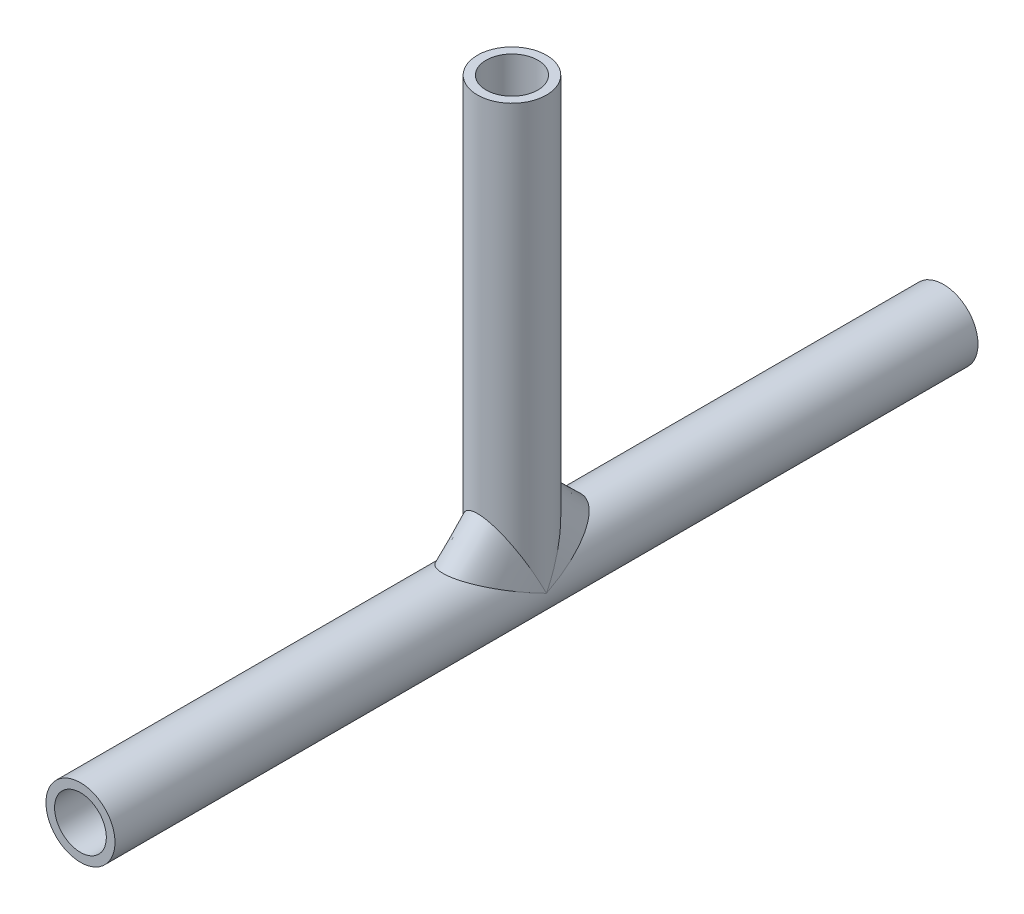
ISO-10303-21;
HEADER;
FILE_DESCRIPTION(('STEP AP214'),'2;1');
FILE_NAME('part.step','',(''),(''),'','','');
FILE_SCHEMA(('AUTOMOTIVE_DESIGN { 1 0 10303 214 1 1 1 1 }'));
ENDSEC;
DATA;
#1=APPLICATION_CONTEXT('core data for automotive mechanical design processes');
#2=APPLICATION_PROTOCOL_DEFINITION('international standard','automotive_design',2000,#1);
#3=PRODUCT_CONTEXT('',#1,'mechanical');
#4=PRODUCT('Part','Part','',(#3));
#5=PRODUCT_RELATED_PRODUCT_CATEGORY('part','',(#4));
#6=PRODUCT_DEFINITION_FORMATION('','',#4);
#7=PRODUCT_DEFINITION_CONTEXT('part definition',#1,'design');
#8=PRODUCT_DEFINITION('design','',#6,#7);
#9=PRODUCT_DEFINITION_SHAPE('','',#8);
#10=(LENGTH_UNIT() NAMED_UNIT(*) SI_UNIT(.MILLI.,.METRE.));
#11=(NAMED_UNIT(*) PLANE_ANGLE_UNIT() SI_UNIT($,.RADIAN.));
#12=(NAMED_UNIT(*) SI_UNIT($,.STERADIAN.) SOLID_ANGLE_UNIT());
#13=UNCERTAINTY_MEASURE_WITH_UNIT(LENGTH_MEASURE(1.E-05),#10,'distance_accuracy_value','');
#14=(GEOMETRIC_REPRESENTATION_CONTEXT(3) GLOBAL_UNCERTAINTY_ASSIGNED_CONTEXT((#13)) GLOBAL_UNIT_ASSIGNED_CONTEXT((#10,
#11,#12)) REPRESENTATION_CONTEXT('',''));
#15=CARTESIAN_POINT('',(0.,0.,0.));
#16=DIRECTION('',(0.,0.,1.));
#17=DIRECTION('',(1.,0.,0.));
#18=AXIS2_PLACEMENT_3D('',#15,#16,#17);
#19=CARTESIAN_POINT('',(0.,0.,12.5));
#20=DIRECTION('',(0.,0.,-1.));
#21=DIRECTION('',(-1.,0.,0.));
#22=AXIS2_PLACEMENT_3D('',#19,#20,#21);
#23=CYLINDRICAL_SURFACE('',#22,1.);
#24=CARTESIAN_POINT('',(0.,0.,-12.5));
#25=DIRECTION('',(0.,0.,1.));
#26=DIRECTION('',(1.,0.,0.));
#27=AXIS2_PLACEMENT_3D('',#24,#25,#26);
#28=CIRCLE('',#27,1.);
#29=CARTESIAN_POINT('',(1.,0.,-12.5));
#30=VERTEX_POINT('',#29);
#31=EDGE_CURVE('E100',#30,#30,#28,.T.);
#32=ORIENTED_EDGE('',*,*,#31,.T.);
#33=EDGE_LOOP('',(#32));
#34=FACE_BOUND('',#33,.T.);
#35=CARTESIAN_POINT('',(0.,0.,12.5));
#36=DIRECTION('',(0.,0.,1.));
#37=DIRECTION('',(1.,0.,0.));
#38=AXIS2_PLACEMENT_3D('',#35,#36,#37);
#39=CIRCLE('',#38,1.);
#40=CARTESIAN_POINT('',(1.,0.,12.5));
#41=VERTEX_POINT('',#40);
#42=EDGE_CURVE('E104',#41,#41,#39,.T.);
#43=ORIENTED_EDGE('',*,*,#42,.F.);
#44=EDGE_LOOP('',(#43));
#45=FACE_BOUND('',#44,.T.);
#46=CARTESIAN_POINT('',(0.999999999999994,0.,0.));
#47=CARTESIAN_POINT('',(1.00006971050876,0.130911339707797,-0.261822679415596));
#48=CARTESIAN_POINT('',(0.973973026383988,0.261739358239071,-0.523478716478148));
#49=CARTESIAN_POINT('',(0.898832785574928,0.443155469428098,-0.8863109388562));
#50=CARTESIAN_POINT('',(0.867831802286448,0.501150369946546,-1.0023007398931));
#51=CARTESIAN_POINT('',(0.795107422318632,0.609990096092654,-1.21998019218532));
#52=CARTESIAN_POINT('',(0.753387070518295,0.660826491854793,-1.3216529837096));
#53=CARTESIAN_POINT('',(0.660826491854794,0.753387070518293,-1.50677414103659));
#54=CARTESIAN_POINT('',(0.609990096172764,0.795107422265105,-1.59021484453022));
#55=CARTESIAN_POINT('',(0.501150369866433,0.867831802339977,-1.73566360467996));
#56=CARTESIAN_POINT('',(0.443151544606336,0.898832820329858,-1.79766564065973));
#57=CARTESIAN_POINT('',(0.322215320123836,0.948926244692707,-1.89785248938542));
#58=CARTESIAN_POINT('',(0.259282927840028,0.968016577210524,-1.93603315442106));
#59=CARTESIAN_POINT('',(0.130897716192225,0.993553983595926,-1.98710796719186));
#60=CARTESIAN_POINT('',(0.0654502135037009,0.999999999999995,-2.));
#61=CARTESIAN_POINT('',(-0.0654502135036992,0.999999999999995,-2.));
#62=CARTESIAN_POINT('',(-0.130897716192225,0.993553983595927,-1.98710796719187));
#63=CARTESIAN_POINT('',(-0.25928292784003,0.968016577210523,-1.93603315442106));
#64=CARTESIAN_POINT('',(-0.322215320123839,0.948926244692706,-1.89785248938542));
#65=CARTESIAN_POINT('',(-0.443151544606339,0.898832820329856,-1.79766564065972));
#66=CARTESIAN_POINT('',(-0.501150369866435,0.867831802339976,-1.73566360467996));
#67=CARTESIAN_POINT('',(-0.609990096172764,0.795107422265104,-1.59021484453022));
#68=CARTESIAN_POINT('',(-0.660826491854793,0.753387070518294,-1.5067741410366));
#69=CARTESIAN_POINT('',(-0.753387070518293,0.660826491854794,-1.3216529837096));
#70=CARTESIAN_POINT('',(-0.795107422318633,0.609990096092653,-1.21998019218531));
#71=CARTESIAN_POINT('',(-0.867831802286449,0.501150369946544,-1.00230073989309));
#72=CARTESIAN_POINT('',(-0.898832785574929,0.443155469428097,-0.886310938856199));
#73=CARTESIAN_POINT('',(-0.973973026383988,0.261739358239071,-0.523478716478142));
#74=CARTESIAN_POINT('',(-1.00006971050876,0.130911339707793,-0.261822679415588));
#75=CARTESIAN_POINT('',(-0.999999999999994,0.,0.));
#76=B_SPLINE_CURVE_WITH_KNOTS('',3,(#46,#47,#48,#49,#50,#51,#52,#53,#54,#55,#56,#57,#58,#59,#60,
#61,#62,#63,#64,#65,#66,#67,#68,#69,#70,#71,#72,#73,#74,#75),.UNSPECIFIED.,.F.,.F.,(4,2,2,2,2,2,
2,2,2,2,2,2,2,2,4),(1.5707963267949,1.96349540849362,2.15984494934298,2.35619449019234,
2.55254403104171,2.74889357189107,2.94524311274043,3.14159265358979,3.33794219443916,
3.53429173528852,3.73064127613788,3.92699081698724,4.1233403578366,4.31968989868597,
4.71238898038469),.UNSPECIFIED.);
#77=CARTESIAN_POINT('',(-1.,0.,0.));
#78=VERTEX_POINT('',#77);
#79=CARTESIAN_POINT('',(1.,0.,0.));
#80=VERTEX_POINT('',#79);
#81=EDGE_CURVE('E60',#78,#80,#76,.F.);
#82=ORIENTED_EDGE('',*,*,#81,.T.);
#83=CARTESIAN_POINT('',(-0.999999999999994,0.,0.));
#84=CARTESIAN_POINT('',(-1.00006971050876,0.130911339707792,0.261822679415587));
#85=CARTESIAN_POINT('',(-0.973973026383988,0.261739358239072,0.523478716478148));
#86=CARTESIAN_POINT('',(-0.898832785574928,0.443155469428096,0.886310938856198));
#87=CARTESIAN_POINT('',(-0.867831802286449,0.501150369946545,1.0023007398931));
#88=CARTESIAN_POINT('',(-0.795107422318632,0.609990096092654,1.21998019218531));
#89=CARTESIAN_POINT('',(-0.753387070518293,0.660826491854795,1.3216529837096));
#90=CARTESIAN_POINT('',(-0.660826491854793,0.753387070518294,1.5067741410366));
#91=CARTESIAN_POINT('',(-0.609990096172764,0.795107422265105,1.59021484453022));
#92=CARTESIAN_POINT('',(-0.501150369866435,0.867831802339976,1.73566360467996));
#93=CARTESIAN_POINT('',(-0.443151544606339,0.898832820329857,1.79766564065972));
#94=CARTESIAN_POINT('',(-0.322215320123839,0.948926244692706,1.89785248938542));
#95=CARTESIAN_POINT('',(-0.25928292784003,0.968016577210523,1.93603315442106));
#96=CARTESIAN_POINT('',(-0.130897716192225,0.993553983595927,1.98710796719187));
#97=CARTESIAN_POINT('',(-0.0654502135036989,0.999999999999995,2.));
#98=CARTESIAN_POINT('',(0.065450213503701,0.999999999999995,2.));
#99=CARTESIAN_POINT('',(0.130897716192225,0.993553983595927,1.98710796719186));
#100=CARTESIAN_POINT('',(0.259282927840028,0.968016577210523,1.93603315442106));
#101=CARTESIAN_POINT('',(0.322215320123837,0.948926244692706,1.89785248938542));
#102=CARTESIAN_POINT('',(0.443151544606336,0.898832820329858,1.79766564065973));
#103=CARTESIAN_POINT('',(0.501150369866433,0.867831802339978,1.73566360467997));
#104=CARTESIAN_POINT('',(0.609990096172764,0.795107422265104,1.59021484453022));
#105=CARTESIAN_POINT('',(0.660826491854795,0.753387070518293,1.50677414103659));
#106=CARTESIAN_POINT('',(0.753387070518294,0.660826491854793,1.32165298370959));
#107=CARTESIAN_POINT('',(0.795107422318633,0.609990096092653,1.21998019218531));
#108=CARTESIAN_POINT('',(0.867831802286448,0.501150369946546,1.0023007398931));
#109=CARTESIAN_POINT('',(0.898832785574928,0.443155469428098,0.886310938856199));
#110=CARTESIAN_POINT('',(0.973973026383987,0.261739358239071,0.523478716478145));
#111=CARTESIAN_POINT('',(1.00006971050876,0.130911339707797,0.261822679415594));
#112=CARTESIAN_POINT('',(0.999999999999994,0.,0.));
#113=B_SPLINE_CURVE_WITH_KNOTS('',3,(#83,#84,#85,#86,#87,#88,#89,#90,#91,#92,#93,#94,#95,#96,
#97,#98,#99,#100,#101,#102,#103,#104,#105,#106,#107,#108,#109,#110,#111,#112),.UNSPECIFIED.,.F.,
.F.,(4,2,2,2,2,2,2,2,2,2,2,2,2,2,4),(1.5707963267949,1.96349540849362,2.15984494934298,
2.35619449019234,2.55254403104171,2.74889357189107,2.94524311274043,3.14159265358979,
3.33794219443916,3.53429173528852,3.73064127613788,3.92699081698724,4.1233403578366,
4.31968989868597,4.71238898038469),.UNSPECIFIED.);
#114=EDGE_CURVE('E11',#80,#78,#113,.F.);
#115=ORIENTED_EDGE('',*,*,#114,.T.);
#116=EDGE_LOOP('',(#82,#115));
#117=FACE_BOUND('',#116,.T.);
#118=ADVANCED_FACE('F45',(#34,#45,#117),#23,.T.);
#119=CARTESIAN_POINT('',(0.,0.,12.5));
#120=DIRECTION('',(0.,0.,1.));
#121=DIRECTION('',(1.,0.,0.));
#122=AXIS2_PLACEMENT_3D('',#119,#120,#121);
#123=PLANE('',#122);
#124=ORIENTED_EDGE('',*,*,#42,.T.);
#125=EDGE_LOOP('',(#124));
#126=FACE_BOUND('',#125,.T.);
#127=CARTESIAN_POINT('',(0.,0.,12.5));
#128=DIRECTION('',(0.,0.,1.));
#129=DIRECTION('',(1.,0.,0.));
#130=AXIS2_PLACEMENT_3D('',#127,#128,#129);
#131=CIRCLE('',#130,0.750000000000001);
#132=CARTESIAN_POINT('',(0.750000000000001,0.,12.5));
#133=VERTEX_POINT('',#132);
#134=EDGE_CURVE('E96',#133,#133,#131,.T.);
#135=ORIENTED_EDGE('',*,*,#134,.F.);
#136=EDGE_LOOP('',(#135));
#137=FACE_BOUND('',#136,.T.);
#138=ADVANCED_FACE('F161',(#126,#137),#123,.T.);
#139=CARTESIAN_POINT('',(0.,0.,-12.5));
#140=DIRECTION('',(0.,0.,1.));
#141=DIRECTION('',(1.,0.,0.));
#142=AXIS2_PLACEMENT_3D('',#139,#140,#141);
#143=PLANE('',#142);
#144=ORIENTED_EDGE('',*,*,#31,.F.);
#145=EDGE_LOOP('',(#144));
#146=FACE_BOUND('',#145,.T.);
#147=CARTESIAN_POINT('',(0.,0.,-12.5));
#148=DIRECTION('',(0.,0.,1.));
#149=DIRECTION('',(1.,0.,0.));
#150=AXIS2_PLACEMENT_3D('',#147,#148,#149);
#151=CIRCLE('',#150,0.750000000000001);
#152=CARTESIAN_POINT('',(0.750000000000001,0.,-12.5));
#153=VERTEX_POINT('',#152);
#154=EDGE_CURVE('E95',#153,#153,#151,.T.);
#155=ORIENTED_EDGE('',*,*,#154,.T.);
#156=EDGE_LOOP('',(#155));
#157=FACE_BOUND('',#156,.T.);
#158=ADVANCED_FACE('F132',(#146,#157),#143,.F.);
#159=CARTESIAN_POINT('',(0.,12.5,0.));
#160=DIRECTION('',(0.,-1.,0.));
#161=DIRECTION('',(0.,0.,-1.));
#162=AXIS2_PLACEMENT_3D('',#159,#160,#161);
#163=CYLINDRICAL_SURFACE('',#162,1.);
#164=CARTESIAN_POINT('',(0.,12.5,0.));
#165=DIRECTION('',(0.,1.,0.));
#166=DIRECTION('',(0.,0.,1.));
#167=AXIS2_PLACEMENT_3D('',#164,#165,#166);
#168=CIRCLE('',#167,1.);
#169=CARTESIAN_POINT('',(0.,12.5,1.));
#170=VERTEX_POINT('',#169);
#171=EDGE_CURVE('E89',#170,#170,#168,.T.);
#172=ORIENTED_EDGE('',*,*,#171,.F.);
#173=EDGE_LOOP('',(#172));
#174=FACE_BOUND('',#173,.T.);
#175=CARTESIAN_POINT('',(-1.,0.,0.));
#176=CARTESIAN_POINT('',(-1.00006971050877,0.261822679415588,-0.130911339707793));
#177=CARTESIAN_POINT('',(-0.973973026383998,0.523478716478142,-0.261739358239074));
#178=CARTESIAN_POINT('',(-0.898832785574938,0.886310938856199,-0.443155469428101));
#179=CARTESIAN_POINT('',(-0.867831802286458,1.00230073989309,-0.50115036994655));
#180=CARTESIAN_POINT('',(-0.795107422318641,1.21998019218531,-0.609990096092659));
#181=CARTESIAN_POINT('',(-0.753387070518301,1.3216529837096,-0.660826491854801));
#182=CARTESIAN_POINT('',(-0.660826491854801,1.5067741410366,-0.753387070518302));
#183=CARTESIAN_POINT('',(-0.609990096172771,1.59021484453022,-0.795107422265112));
#184=CARTESIAN_POINT('',(-0.501150369866441,1.73566360467996,-0.867831802339985));
#185=CARTESIAN_POINT('',(-0.443151544606343,1.79766564065972,-0.898832820329866));
#186=CARTESIAN_POINT('',(-0.322215320123843,1.89785248938542,-0.948926244692716));
#187=CARTESIAN_POINT('',(-0.259282927840034,1.93603315442106,-0.968016577210533));
#188=CARTESIAN_POINT('',(-0.130897716192227,1.98710796719187,-0.993553983595937));
#189=CARTESIAN_POINT('',(-0.0654502135037003,2.,-1.));
#190=CARTESIAN_POINT('',(0.0654502135037019,2.,-1.00000000000001));
#191=CARTESIAN_POINT('',(0.130897716192226,1.98710796719186,-0.993553983595937));
#192=CARTESIAN_POINT('',(0.259282927840031,1.93603315442106,-0.968016577210534));
#193=CARTESIAN_POINT('',(0.32221532012384,1.89785248938542,-0.948926244692717));
#194=CARTESIAN_POINT('',(0.443151544606341,1.79766564065973,-0.898832820329867));
#195=CARTESIAN_POINT('',(0.501150369866438,1.73566360467996,-0.867831802339987));
#196=CARTESIAN_POINT('',(0.60999009617277,1.59021484453022,-0.795107422265113));
#197=CARTESIAN_POINT('',(0.660826491854801,1.50677414103659,-0.753387070518301));
#198=CARTESIAN_POINT('',(0.753387070518302,1.3216529837096,-0.6608264918548));
#199=CARTESIAN_POINT('',(0.79510742231864,1.21998019218532,-0.60999009609266));
#200=CARTESIAN_POINT('',(0.867831802286457,1.0023007398931,-0.501150369946552));
#201=CARTESIAN_POINT('',(0.898832785574937,0.8863109388562,-0.443155469428102));
#202=CARTESIAN_POINT('',(0.973973026383998,0.523478716478148,-0.261739358239074));
#203=CARTESIAN_POINT('',(1.00006971050877,0.261822679415596,-0.130911339707798));
#204=CARTESIAN_POINT('',(1.,0.,0.));
#205=B_SPLINE_CURVE_WITH_KNOTS('',3,(#175,#176,#177,#178,#179,#180,#181,#182,#183,#184,#185,
#186,#187,#188,#189,#190,#191,#192,#193,#194,#195,#196,#197,#198,#199,#200,#201,#202,#203,#204),
.UNSPECIFIED.,.F.,.F.,(4,2,2,2,2,2,2,2,2,2,2,2,2,2,4),(1.5707963267949,1.96349540849362,
2.15984494934298,2.35619449019234,2.55254403104171,2.74889357189107,2.94524311274043,
3.14159265358979,3.33794219443916,3.53429173528852,3.73064127613788,3.92699081698724,
4.1233403578366,4.31968989868597,4.71238898038469),.UNSPECIFIED.);
#206=EDGE_CURVE('E108',#80,#78,#205,.F.);
#207=ORIENTED_EDGE('',*,*,#206,.T.);
#208=CARTESIAN_POINT('',(1.,0.,0.));
#209=CARTESIAN_POINT('',(1.00006971050877,0.261822679415594,0.130911339707798));
#210=CARTESIAN_POINT('',(0.973973026383998,0.523478716478145,0.261739358239074));
#211=CARTESIAN_POINT('',(0.898832785574938,0.886310938856199,0.443155469428102));
#212=CARTESIAN_POINT('',(0.867831802286457,1.0023007398931,0.501150369946552));
#213=CARTESIAN_POINT('',(0.795107422318641,1.21998019218531,0.60999009609266));
#214=CARTESIAN_POINT('',(0.753387070518302,1.32165298370959,0.6608264918548));
#215=CARTESIAN_POINT('',(0.660826491854801,1.50677414103659,0.7533870705183));
#216=CARTESIAN_POINT('',(0.60999009617277,1.59021484453022,0.795107422265113));
#217=CARTESIAN_POINT('',(0.501150369866439,1.73566360467997,0.867831802339987));
#218=CARTESIAN_POINT('',(0.443151544606341,1.79766564065973,0.898832820329867));
#219=CARTESIAN_POINT('',(0.32221532012384,1.89785248938542,0.948926244692716));
#220=CARTESIAN_POINT('',(0.259282927840031,1.93603315442106,0.968016577210533));
#221=CARTESIAN_POINT('',(0.130897716192226,1.98710796719186,0.993553983595937));
#222=CARTESIAN_POINT('',(0.0654502135037012,2.,1.00000000000001));
#223=CARTESIAN_POINT('',(-0.0654502135036991,2.,1.));
#224=CARTESIAN_POINT('',(-0.130897716192226,1.98710796719187,0.993553983595938));
#225=CARTESIAN_POINT('',(-0.259282927840032,1.93603315442106,0.968016577210533));
#226=CARTESIAN_POINT('',(-0.322215320123842,1.89785248938542,0.948926244692716));
#227=CARTESIAN_POINT('',(-0.443151544606343,1.79766564065972,0.898832820329866));
#228=CARTESIAN_POINT('',(-0.50115036986644,1.73566360467996,0.867831802339986));
#229=CARTESIAN_POINT('',(-0.60999009617277,1.59021484453022,0.795107422265113));
#230=CARTESIAN_POINT('',(-0.6608264918548,1.5067741410366,0.753387070518302));
#231=CARTESIAN_POINT('',(-0.7533870705183,1.3216529837096,0.660826491854802));
#232=CARTESIAN_POINT('',(-0.79510742231864,1.21998019218531,0.60999009609266));
#233=CARTESIAN_POINT('',(-0.867831802286458,1.0023007398931,0.50115036994655));
#234=CARTESIAN_POINT('',(-0.898832785574938,0.886310938856198,0.443155469428101));
#235=CARTESIAN_POINT('',(-0.973973026383998,0.523478716478148,0.261739358239074));
#236=CARTESIAN_POINT('',(-1.00006971050877,0.261822679415587,0.130911339707794));
#237=CARTESIAN_POINT('',(-1.,0.,0.));
#238=B_SPLINE_CURVE_WITH_KNOTS('',3,(#208,#209,#210,#211,#212,#213,#214,#215,#216,#217,#218,
#219,#220,#221,#222,#223,#224,#225,#226,#227,#228,#229,#230,#231,#232,#233,#234,#235,#236,#237),
.UNSPECIFIED.,.F.,.F.,(4,2,2,2,2,2,2,2,2,2,2,2,2,2,4),(1.5707963267949,1.96349540849362,
2.15984494934298,2.35619449019234,2.55254403104171,2.74889357189107,2.94524311274043,
3.14159265358979,3.33794219443916,3.53429173528852,3.73064127613788,3.92699081698724,
4.1233403578366,4.31968989868597,4.71238898038469),.UNSPECIFIED.);
#239=EDGE_CURVE('E179',#78,#80,#238,.F.);
#240=ORIENTED_EDGE('',*,*,#239,.T.);
#241=EDGE_LOOP('',(#207,#240));
#242=FACE_BOUND('',#241,.T.);
#243=ADVANCED_FACE('F122',(#174,#242),#163,.T.);
#244=CARTESIAN_POINT('',(0.,12.5,0.));
#245=DIRECTION('',(0.,-1.,0.));
#246=DIRECTION('',(0.,0.,-1.));
#247=AXIS2_PLACEMENT_3D('',#244,#245,#246);
#248=CYLINDRICAL_SURFACE('',#247,0.75);
#249=CARTESIAN_POINT('',(0.,12.5,0.));
#250=DIRECTION('',(0.,1.,0.));
#251=DIRECTION('',(0.,0.,1.));
#252=AXIS2_PLACEMENT_3D('',#249,#250,#251);
#253=CIRCLE('',#252,0.75);
#254=CARTESIAN_POINT('',(0.,12.5,0.75));
#255=VERTEX_POINT('',#254);
#256=EDGE_CURVE('E85',#255,#255,#253,.T.);
#257=ORIENTED_EDGE('',*,*,#256,.T.);
#258=EDGE_LOOP('',(#257));
#259=FACE_BOUND('',#258,.T.);
#260=CARTESIAN_POINT('',(0.,0.,0.));
#261=DIRECTION('',(0.,0.707106781186547,0.707106781186547));
#262=DIRECTION('',(0.,0.707106781186547,-0.707106781186547));
#263=AXIS2_PLACEMENT_3D('',#260,#261,#262);
#264=ELLIPSE('',#263,1.06066017177982,0.75);
#265=CARTESIAN_POINT('',(0.75,0.,0.));
#266=VERTEX_POINT('',#265);
#267=CARTESIAN_POINT('',(-0.75,0.,0.));
#268=VERTEX_POINT('',#267);
#269=EDGE_CURVE('E77',#266,#268,#264,.T.);
#270=ORIENTED_EDGE('',*,*,#269,.F.);
#271=CARTESIAN_POINT('',(0.,0.,0.));
#272=DIRECTION('',(0.,0.707106781186547,-0.707106781186547));
#273=DIRECTION('',(0.,0.707106781186547,0.707106781186547));
#274=AXIS2_PLACEMENT_3D('',#271,#272,#273);
#275=ELLIPSE('',#274,1.06066017177982,0.75);
#276=EDGE_CURVE('E66',#268,#266,#275,.T.);
#277=ORIENTED_EDGE('',*,*,#276,.F.);
#278=EDGE_LOOP('',(#270,#277));
#279=FACE_BOUND('',#278,.T.);
#280=ADVANCED_FACE('F78',(#259,#279),#248,.F.);
#281=CARTESIAN_POINT('',(0.,12.5,0.));
#282=DIRECTION('',(0.,1.,0.));
#283=DIRECTION('',(0.,0.,1.));
#284=AXIS2_PLACEMENT_3D('',#281,#282,#283);
#285=PLANE('',#284);
#286=ORIENTED_EDGE('',*,*,#171,.T.);
#287=EDGE_LOOP('',(#286));
#288=FACE_BOUND('',#287,.T.);
#289=ORIENTED_EDGE('',*,*,#256,.F.);
#290=EDGE_LOOP('',(#289));
#291=FACE_BOUND('',#290,.T.);
#292=ADVANCED_FACE('F134',(#288,#291),#285,.T.);
#293=CARTESIAN_POINT('',(0.,0.,12.5));
#294=DIRECTION('',(0.,0.,-1.));
#295=DIRECTION('',(-1.,0.,0.));
#296=AXIS2_PLACEMENT_3D('',#293,#294,#295);
#297=CYLINDRICAL_SURFACE('',#296,0.750000000000001);
#298=ORIENTED_EDGE('',*,*,#276,.T.);
#299=ORIENTED_EDGE('',*,*,#269,.T.);
#300=EDGE_LOOP('',(#298,#299));
#301=FACE_BOUND('',#300,.T.);
#302=ORIENTED_EDGE('',*,*,#134,.T.);
#303=EDGE_LOOP('',(#302));
#304=FACE_BOUND('',#303,.T.);
#305=ORIENTED_EDGE('',*,*,#154,.F.);
#306=EDGE_LOOP('',(#305));
#307=FACE_BOUND('',#306,.T.);
#308=ADVANCED_FACE('F82',(#301,#304,#307),#297,.F.);
#309=CARTESIAN_POINT('',(-1.,0.,0.));
#310=CARTESIAN_POINT('',(-1.00006971050877,0.261822679415587,0.130911339707794));
#311=CARTESIAN_POINT('',(-0.973973026383998,0.523478716478148,0.261739358239074));
#312=CARTESIAN_POINT('',(-0.898832785574938,0.886310938856198,0.443155469428101));
#313=CARTESIAN_POINT('',(-0.867831802286458,1.0023007398931,0.50115036994655));
#314=CARTESIAN_POINT('',(-0.79510742231864,1.21998019218531,0.60999009609266));
#315=CARTESIAN_POINT('',(-0.7533870705183,1.3216529837096,0.660826491854802));
#316=CARTESIAN_POINT('',(-0.6608264918548,1.5067741410366,0.753387070518302));
#317=CARTESIAN_POINT('',(-0.60999009617277,1.59021484453022,0.795107422265113));
#318=CARTESIAN_POINT('',(-0.50115036986644,1.73566360467996,0.867831802339986));
#319=CARTESIAN_POINT('',(-0.443151544606343,1.79766564065972,0.898832820329866));
#320=CARTESIAN_POINT('',(-0.322215320123842,1.89785248938542,0.948926244692716));
#321=CARTESIAN_POINT('',(-0.259282927840032,1.93603315442106,0.968016577210533));
#322=CARTESIAN_POINT('',(-0.130897716192226,1.98710796719187,0.993553983595938));
#323=CARTESIAN_POINT('',(-0.0654502135036991,2.,1.));
#324=CARTESIAN_POINT('',(0.0654502135037012,2.,1.00000000000001));
#325=CARTESIAN_POINT('',(0.130897716192226,1.98710796719186,0.993553983595937));
#326=CARTESIAN_POINT('',(0.259282927840031,1.93603315442106,0.968016577210533));
#327=CARTESIAN_POINT('',(0.32221532012384,1.89785248938542,0.948926244692716));
#328=CARTESIAN_POINT('',(0.443151544606341,1.79766564065973,0.898832820329867));
#329=CARTESIAN_POINT('',(0.501150369866439,1.73566360467997,0.867831802339987));
#330=CARTESIAN_POINT('',(0.60999009617277,1.59021484453022,0.795107422265113));
#331=CARTESIAN_POINT('',(0.660826491854801,1.50677414103659,0.7533870705183));
#332=CARTESIAN_POINT('',(0.753387070518302,1.32165298370959,0.6608264918548));
#333=CARTESIAN_POINT('',(0.795107422318641,1.21998019218531,0.60999009609266));
#334=CARTESIAN_POINT('',(0.867831802286457,1.0023007398931,0.501150369946552));
#335=CARTESIAN_POINT('',(0.898832785574938,0.886310938856199,0.443155469428102));
#336=CARTESIAN_POINT('',(0.973973026383998,0.523478716478145,0.261739358239074));
#337=CARTESIAN_POINT('',(1.00006971050877,0.261822679415594,0.130911339707798));
#338=CARTESIAN_POINT('',(1.,0.,0.));
#339=CARTESIAN_POINT('',(-0.999999999999994,0.,0.));
#340=CARTESIAN_POINT('',(-1.00006971050876,0.130911339707792,0.261822679415587));
#341=CARTESIAN_POINT('',(-0.973973026383988,0.261739358239072,0.523478716478148));
#342=CARTESIAN_POINT('',(-0.898832785574928,0.443155469428096,0.886310938856198));
#343=CARTESIAN_POINT('',(-0.867831802286449,0.501150369946545,1.0023007398931));
#344=CARTESIAN_POINT('',(-0.795107422318632,0.609990096092654,1.21998019218531));
#345=CARTESIAN_POINT('',(-0.753387070518293,0.660826491854795,1.3216529837096));
#346=CARTESIAN_POINT('',(-0.660826491854793,0.753387070518294,1.5067741410366));
#347=CARTESIAN_POINT('',(-0.609990096172764,0.795107422265105,1.59021484453022));
#348=CARTESIAN_POINT('',(-0.501150369866435,0.867831802339976,1.73566360467996));
#349=CARTESIAN_POINT('',(-0.443151544606339,0.898832820329857,1.79766564065972));
#350=CARTESIAN_POINT('',(-0.322215320123839,0.948926244692706,1.89785248938542));
#351=CARTESIAN_POINT('',(-0.25928292784003,0.968016577210523,1.93603315442106));
#352=CARTESIAN_POINT('',(-0.130897716192225,0.993553983595927,1.98710796719187));
#353=CARTESIAN_POINT('',(-0.0654502135036989,0.999999999999995,2.));
#354=CARTESIAN_POINT('',(0.065450213503701,0.999999999999995,2.));
#355=CARTESIAN_POINT('',(0.130897716192225,0.993553983595927,1.98710796719186));
#356=CARTESIAN_POINT('',(0.259282927840028,0.968016577210523,1.93603315442106));
#357=CARTESIAN_POINT('',(0.322215320123837,0.948926244692706,1.89785248938542));
#358=CARTESIAN_POINT('',(0.443151544606336,0.898832820329858,1.79766564065973));
#359=CARTESIAN_POINT('',(0.501150369866433,0.867831802339978,1.73566360467997));
#360=CARTESIAN_POINT('',(0.609990096172764,0.795107422265104,1.59021484453022));
#361=CARTESIAN_POINT('',(0.660826491854795,0.753387070518293,1.50677414103659));
#362=CARTESIAN_POINT('',(0.753387070518294,0.660826491854793,1.32165298370959));
#363=CARTESIAN_POINT('',(0.795107422318633,0.609990096092653,1.21998019218531));
#364=CARTESIAN_POINT('',(0.867831802286448,0.501150369946546,1.0023007398931));
#365=CARTESIAN_POINT('',(0.898832785574928,0.443155469428098,0.886310938856199));
#366=CARTESIAN_POINT('',(0.973973026383987,0.261739358239071,0.523478716478145));
#367=CARTESIAN_POINT('',(1.00006971050876,0.130911339707797,0.261822679415594));
#368=CARTESIAN_POINT('',(0.999999999999994,0.,0.));
#369=B_SPLINE_SURFACE_WITH_KNOTS('',1,3,((#309,#310,#311,#312,#313,#314,#315,#316,#317,#318,
#319,#320,#321,#322,#323,#324,#325,#326,#327,#328,#329,#330,#331,#332,#333,#334,#335,#336,#337,
#338),(#339,#340,#341,#342,#343,#344,#345,#346,#347,#348,#349,#350,#351,#352,#353,#354,#355,
#356,#357,#358,#359,#360,#361,#362,#363,#364,#365,#366,#367,#368)),.UNSPECIFIED.,.F.,.F.,.F.,(2,
2),(4,2,2,2,2,2,2,2,2,2,2,2,2,2,4),(0.,1.),(1.5707963267949,1.96349540849362,2.15984494934298,
2.35619449019234,2.55254403104171,2.74889357189107,2.94524311274043,3.14159265358979,
3.33794219443916,3.53429173528852,3.73064127613788,3.92699081698724,4.1233403578366,
4.31968989868597,4.71238898038469),.UNSPECIFIED.);
#370=ORIENTED_EDGE('',*,*,#239,.F.);
#371=ORIENTED_EDGE('',*,*,#114,.F.);
#372=EDGE_LOOP('',(#370,#371));
#373=FACE_BOUND('',#372,.T.);
#374=ADVANCED_FACE('F164',(#373),#369,.T.);
#375=CARTESIAN_POINT('',(-0.999999999999994,0.,0.));
#376=CARTESIAN_POINT('',(-1.00006971050876,0.130911339707793,-0.261822679415588));
#377=CARTESIAN_POINT('',(-0.973973026383988,0.261739358239071,-0.523478716478142));
#378=CARTESIAN_POINT('',(-0.898832785574929,0.443155469428097,-0.886310938856199));
#379=CARTESIAN_POINT('',(-0.867831802286449,0.501150369946544,-1.00230073989309));
#380=CARTESIAN_POINT('',(-0.795107422318633,0.609990096092653,-1.21998019218531));
#381=CARTESIAN_POINT('',(-0.753387070518293,0.660826491854794,-1.3216529837096));
#382=CARTESIAN_POINT('',(-0.660826491854793,0.753387070518294,-1.5067741410366));
#383=CARTESIAN_POINT('',(-0.609990096172764,0.795107422265104,-1.59021484453022));
#384=CARTESIAN_POINT('',(-0.501150369866435,0.867831802339976,-1.73566360467996));
#385=CARTESIAN_POINT('',(-0.443151544606339,0.898832820329856,-1.79766564065972));
#386=CARTESIAN_POINT('',(-0.322215320123839,0.948926244692706,-1.89785248938542));
#387=CARTESIAN_POINT('',(-0.25928292784003,0.968016577210523,-1.93603315442106));
#388=CARTESIAN_POINT('',(-0.130897716192225,0.993553983595927,-1.98710796719187));
#389=CARTESIAN_POINT('',(-0.0654502135036992,0.999999999999995,-2.));
#390=CARTESIAN_POINT('',(0.0654502135037009,0.999999999999995,-2.));
#391=CARTESIAN_POINT('',(0.130897716192225,0.993553983595926,-1.98710796719186));
#392=CARTESIAN_POINT('',(0.259282927840028,0.968016577210524,-1.93603315442106));
#393=CARTESIAN_POINT('',(0.322215320123836,0.948926244692707,-1.89785248938542));
#394=CARTESIAN_POINT('',(0.443151544606336,0.898832820329858,-1.79766564065973));
#395=CARTESIAN_POINT('',(0.501150369866433,0.867831802339977,-1.73566360467996));
#396=CARTESIAN_POINT('',(0.609990096172764,0.795107422265105,-1.59021484453022));
#397=CARTESIAN_POINT('',(0.660826491854794,0.753387070518293,-1.50677414103659));
#398=CARTESIAN_POINT('',(0.753387070518295,0.660826491854793,-1.3216529837096));
#399=CARTESIAN_POINT('',(0.795107422318632,0.609990096092654,-1.21998019218532));
#400=CARTESIAN_POINT('',(0.867831802286448,0.501150369946546,-1.0023007398931));
#401=CARTESIAN_POINT('',(0.898832785574928,0.443155469428098,-0.8863109388562));
#402=CARTESIAN_POINT('',(0.973973026383988,0.261739358239071,-0.523478716478148));
#403=CARTESIAN_POINT('',(1.00006971050876,0.130911339707797,-0.261822679415596));
#404=CARTESIAN_POINT('',(0.999999999999994,0.,0.));
#405=CARTESIAN_POINT('',(-1.,0.,0.));
#406=CARTESIAN_POINT('',(-1.00006971050877,0.261822679415588,-0.130911339707793));
#407=CARTESIAN_POINT('',(-0.973973026383998,0.523478716478142,-0.261739358239074));
#408=CARTESIAN_POINT('',(-0.898832785574938,0.886310938856199,-0.443155469428101));
#409=CARTESIAN_POINT('',(-0.867831802286458,1.00230073989309,-0.50115036994655));
#410=CARTESIAN_POINT('',(-0.795107422318641,1.21998019218531,-0.609990096092659));
#411=CARTESIAN_POINT('',(-0.753387070518301,1.3216529837096,-0.660826491854801));
#412=CARTESIAN_POINT('',(-0.660826491854801,1.5067741410366,-0.753387070518302));
#413=CARTESIAN_POINT('',(-0.609990096172771,1.59021484453022,-0.795107422265112));
#414=CARTESIAN_POINT('',(-0.501150369866441,1.73566360467996,-0.867831802339985));
#415=CARTESIAN_POINT('',(-0.443151544606343,1.79766564065972,-0.898832820329866));
#416=CARTESIAN_POINT('',(-0.322215320123843,1.89785248938542,-0.948926244692716));
#417=CARTESIAN_POINT('',(-0.259282927840034,1.93603315442106,-0.968016577210533));
#418=CARTESIAN_POINT('',(-0.130897716192227,1.98710796719187,-0.993553983595937));
#419=CARTESIAN_POINT('',(-0.0654502135037003,2.,-1.));
#420=CARTESIAN_POINT('',(0.0654502135037019,2.,-1.00000000000001));
#421=CARTESIAN_POINT('',(0.130897716192226,1.98710796719186,-0.993553983595937));
#422=CARTESIAN_POINT('',(0.259282927840031,1.93603315442106,-0.968016577210534));
#423=CARTESIAN_POINT('',(0.32221532012384,1.89785248938542,-0.948926244692717));
#424=CARTESIAN_POINT('',(0.443151544606341,1.79766564065973,-0.898832820329867));
#425=CARTESIAN_POINT('',(0.501150369866438,1.73566360467996,-0.867831802339987));
#426=CARTESIAN_POINT('',(0.60999009617277,1.59021484453022,-0.795107422265113));
#427=CARTESIAN_POINT('',(0.660826491854801,1.50677414103659,-0.753387070518301));
#428=CARTESIAN_POINT('',(0.753387070518302,1.3216529837096,-0.6608264918548));
#429=CARTESIAN_POINT('',(0.79510742231864,1.21998019218532,-0.60999009609266));
#430=CARTESIAN_POINT('',(0.867831802286457,1.0023007398931,-0.501150369946552));
#431=CARTESIAN_POINT('',(0.898832785574937,0.8863109388562,-0.443155469428102));
#432=CARTESIAN_POINT('',(0.973973026383998,0.523478716478148,-0.261739358239074));
#433=CARTESIAN_POINT('',(1.00006971050877,0.261822679415596,-0.130911339707798));
#434=CARTESIAN_POINT('',(1.,0.,0.));
#435=B_SPLINE_SURFACE_WITH_KNOTS('',1,3,((#375,#376,#377,#378,#379,#380,#381,#382,#383,#384,
#385,#386,#387,#388,#389,#390,#391,#392,#393,#394,#395,#396,#397,#398,#399,#400,#401,#402,#403,
#404),(#405,#406,#407,#408,#409,#410,#411,#412,#413,#414,#415,#416,#417,#418,#419,#420,#421,
#422,#423,#424,#425,#426,#427,#428,#429,#430,#431,#432,#433,#434)),.UNSPECIFIED.,.F.,.F.,.F.,(2,
2),(4,2,2,2,2,2,2,2,2,2,2,2,2,2,4),(0.,1.),(1.5707963267949,1.96349540849362,2.15984494934298,
2.35619449019234,2.55254403104171,2.74889357189107,2.94524311274043,3.14159265358979,
3.33794219443916,3.53429173528852,3.73064127613788,3.92699081698724,4.1233403578366,
4.31968989868597,4.71238898038469),.UNSPECIFIED.);
#436=ORIENTED_EDGE('',*,*,#206,.F.);
#437=ORIENTED_EDGE('',*,*,#81,.F.);
#438=EDGE_LOOP('',(#436,#437));
#439=FACE_BOUND('',#438,.T.);
#440=ADVANCED_FACE('F48',(#439),#435,.T.);
#441=CLOSED_SHELL('',(#118,#138,#158,#243,#280,#292,#308,#374,#440));
#442=MANIFOLD_SOLID_BREP('B2',#441);
#443=ADVANCED_BREP_SHAPE_REPRESENTATION('',(#18,#442),#14);
#444=SHAPE_DEFINITION_REPRESENTATION(#9,#443);
ENDSEC;
END-ISO-10303-21;
